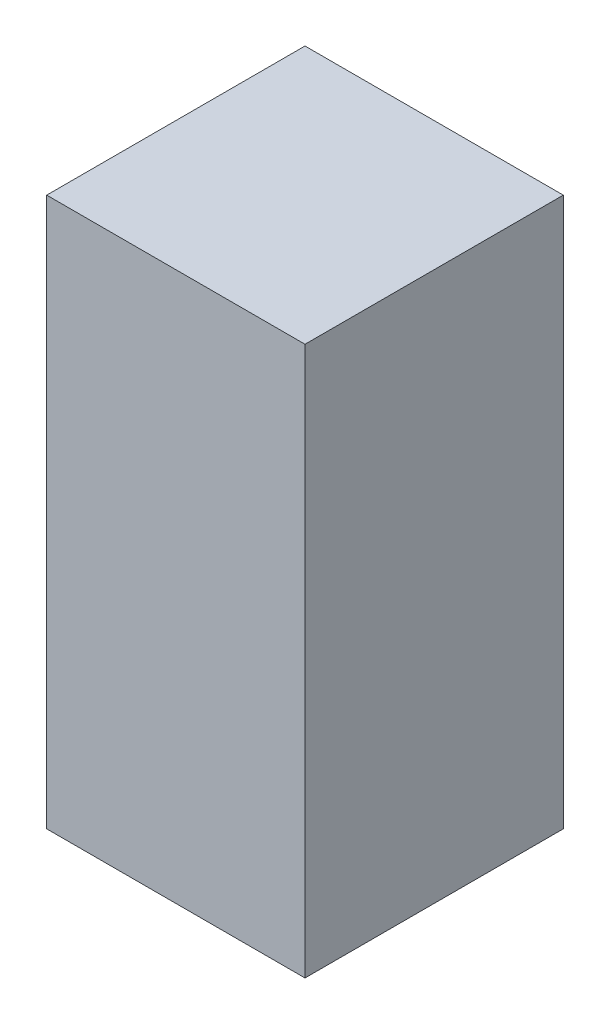
ISO-10303-21;
HEADER;
FILE_DESCRIPTION(('STEP AP214'),'2;1');
FILE_NAME('part.step','',(''),(''),'','','');
FILE_SCHEMA(('AUTOMOTIVE_DESIGN { 1 0 10303 214 1 1 1 1 }'));
ENDSEC;
DATA;
#1=APPLICATION_CONTEXT('core data for automotive mechanical design processes');
#2=APPLICATION_PROTOCOL_DEFINITION('international standard','automotive_design',2000,#1);
#3=PRODUCT_CONTEXT('',#1,'mechanical');
#4=PRODUCT('Part','Part','',(#3));
#5=PRODUCT_RELATED_PRODUCT_CATEGORY('part','',(#4));
#6=PRODUCT_DEFINITION_FORMATION('','',#4);
#7=PRODUCT_DEFINITION_CONTEXT('part definition',#1,'design');
#8=PRODUCT_DEFINITION('design','',#6,#7);
#9=PRODUCT_DEFINITION_SHAPE('','',#8);
#10=(LENGTH_UNIT() NAMED_UNIT(*) SI_UNIT(.MILLI.,.METRE.));
#11=(NAMED_UNIT(*) PLANE_ANGLE_UNIT() SI_UNIT($,.RADIAN.));
#12=(NAMED_UNIT(*) SI_UNIT($,.STERADIAN.) SOLID_ANGLE_UNIT());
#13=UNCERTAINTY_MEASURE_WITH_UNIT(LENGTH_MEASURE(1.E-05),#10,'distance_accuracy_value','');
#14=(GEOMETRIC_REPRESENTATION_CONTEXT(3) GLOBAL_UNCERTAINTY_ASSIGNED_CONTEXT((#13)) GLOBAL_UNIT_ASSIGNED_CONTEXT((#10,
#11,#12)) REPRESENTATION_CONTEXT('',''));
#15=CARTESIAN_POINT('',(0.,0.,0.));
#16=DIRECTION('',(0.,0.,1.));
#17=DIRECTION('',(1.,0.,0.));
#18=AXIS2_PLACEMENT_3D('',#15,#16,#17);
#19=CARTESIAN_POINT('',(0.3999992,-0.85000084,0.));
#20=DIRECTION('',(-1.,0.,0.));
#21=DIRECTION('',(0.,0.,1.));
#22=AXIS2_PLACEMENT_3D('',#19,#20,#21);
#23=PLANE('',#22);
#24=DIRECTION('',(0.,0.,-1.));
#25=VECTOR('',#24,1.);
#26=CARTESIAN_POINT('',(0.3999992,0.85000084,0.));
#27=LINE('',#26,#25);
#28=CARTESIAN_POINT('',(0.3999992,0.85000084,0.));
#29=VERTEX_POINT('',#28);
#30=CARTESIAN_POINT('',(0.3999992,0.85000084,0.80000094));
#31=VERTEX_POINT('',#30);
#32=EDGE_CURVE('E19',#29,#31,#27,.F.);
#33=ORIENTED_EDGE('',*,*,#32,.T.);
#34=DIRECTION('',(0.,1.,0.));
#35=VECTOR('',#34,1.);
#36=CARTESIAN_POINT('',(0.3999992,0.85000084,0.80000094));
#37=LINE('',#36,#35);
#38=CARTESIAN_POINT('',(0.3999992,-0.85000084,0.80000094));
#39=VERTEX_POINT('',#38);
#40=EDGE_CURVE('E54',#31,#39,#37,.F.);
#41=ORIENTED_EDGE('',*,*,#40,.T.);
#42=DIRECTION('',(0.,0.,1.));
#43=VECTOR('',#42,1.);
#44=CARTESIAN_POINT('',(0.3999992,-0.85000084,0.));
#45=LINE('',#44,#43);
#46=CARTESIAN_POINT('',(0.3999992,-0.85000084,0.));
#47=VERTEX_POINT('',#46);
#48=EDGE_CURVE('E73',#39,#47,#45,.F.);
#49=ORIENTED_EDGE('',*,*,#48,.T.);
#50=DIRECTION('',(0.,1.,0.));
#51=VECTOR('',#50,1.);
#52=CARTESIAN_POINT('',(0.3999992,0.85000084,0.));
#53=LINE('',#52,#51);
#54=EDGE_CURVE('E65',#29,#47,#53,.F.);
#55=ORIENTED_EDGE('',*,*,#54,.F.);
#56=EDGE_LOOP('',(#33,#41,#49,#55));
#57=FACE_BOUND('',#56,.T.);
#58=ADVANCED_FACE('F16',(#57),#23,.F.);
#59=CARTESIAN_POINT('',(0.3999992,0.85000084,0.));
#60=DIRECTION('',(0.,-1.,0.));
#61=DIRECTION('',(0.,0.,-1.));
#62=AXIS2_PLACEMENT_3D('',#59,#60,#61);
#63=PLANE('',#62);
#64=DIRECTION('',(0.,0.,-1.));
#65=VECTOR('',#64,1.);
#66=CARTESIAN_POINT('',(-0.3999992,0.85000084,0.));
#67=LINE('',#66,#65);
#68=CARTESIAN_POINT('',(-0.3999992,0.85000084,0.));
#69=VERTEX_POINT('',#68);
#70=CARTESIAN_POINT('',(-0.3999992,0.85000084,0.80000094));
#71=VERTEX_POINT('',#70);
#72=EDGE_CURVE('E71',#69,#71,#67,.F.);
#73=ORIENTED_EDGE('',*,*,#72,.T.);
#74=DIRECTION('',(-1.,0.,0.));
#75=VECTOR('',#74,1.);
#76=CARTESIAN_POINT('',(0.3999992,0.85000084,0.80000094));
#77=LINE('',#76,#75);
#78=EDGE_CURVE('E61',#71,#31,#77,.F.);
#79=ORIENTED_EDGE('',*,*,#78,.T.);
#80=ORIENTED_EDGE('',*,*,#32,.F.);
#81=DIRECTION('',(-1.,0.,0.));
#82=VECTOR('',#81,1.);
#83=CARTESIAN_POINT('',(0.3999992,0.85000084,0.));
#84=LINE('',#83,#82);
#85=EDGE_CURVE('E79',#69,#29,#84,.F.);
#86=ORIENTED_EDGE('',*,*,#85,.F.);
#87=EDGE_LOOP('',(#73,#79,#80,#86));
#88=FACE_BOUND('',#87,.T.);
#89=ADVANCED_FACE('F70',(#88),#63,.F.);
#90=CARTESIAN_POINT('',(0.3999992,0.85000084,0.80000094));
#91=DIRECTION('',(0.,0.,-1.));
#92=DIRECTION('',(-1.,0.,0.));
#93=AXIS2_PLACEMENT_3D('',#90,#91,#92);
#94=PLANE('',#93);
#95=DIRECTION('',(0.,1.,0.));
#96=VECTOR('',#95,1.);
#97=CARTESIAN_POINT('',(-0.3999992,0.85000084,0.80000094));
#98=LINE('',#97,#96);
#99=CARTESIAN_POINT('',(-0.3999992,-0.85000084,0.80000094));
#100=VERTEX_POINT('',#99);
#101=EDGE_CURVE('E82',#71,#100,#98,.F.);
#102=ORIENTED_EDGE('',*,*,#101,.T.);
#103=DIRECTION('',(1.,0.,0.));
#104=VECTOR('',#103,1.);
#105=CARTESIAN_POINT('',(-0.3999992,-0.85000084,0.80000094));
#106=LINE('',#105,#104);
#107=EDGE_CURVE('E63',#100,#39,#106,.T.);
#108=ORIENTED_EDGE('',*,*,#107,.T.);
#109=ORIENTED_EDGE('',*,*,#40,.F.);
#110=ORIENTED_EDGE('',*,*,#78,.F.);
#111=EDGE_LOOP('',(#102,#108,#109,#110));
#112=FACE_BOUND('',#111,.T.);
#113=ADVANCED_FACE('F59',(#112),#94,.F.);
#114=CARTESIAN_POINT('',(-0.3999992,-0.85000084,0.));
#115=DIRECTION('',(0.,1.,0.));
#116=DIRECTION('',(0.,0.,1.));
#117=AXIS2_PLACEMENT_3D('',#114,#115,#116);
#118=PLANE('',#117);
#119=ORIENTED_EDGE('',*,*,#48,.F.);
#120=ORIENTED_EDGE('',*,*,#107,.F.);
#121=DIRECTION('',(0.,0.,-1.));
#122=VECTOR('',#121,1.);
#123=CARTESIAN_POINT('',(-0.3999992,-0.85000084,0.));
#124=LINE('',#123,#122);
#125=CARTESIAN_POINT('',(-0.3999992,-0.85000084,0.));
#126=VERTEX_POINT('',#125);
#127=EDGE_CURVE('E25',#100,#126,#124,.T.);
#128=ORIENTED_EDGE('',*,*,#127,.T.);
#129=DIRECTION('',(-1.,0.,0.));
#130=VECTOR('',#129,1.);
#131=CARTESIAN_POINT('',(0.3999992,-0.85000084,0.));
#132=LINE('',#131,#130);
#133=EDGE_CURVE('E33',#47,#126,#132,.T.);
#134=ORIENTED_EDGE('',*,*,#133,.F.);
#135=EDGE_LOOP('',(#119,#120,#128,#134));
#136=FACE_BOUND('',#135,.T.);
#137=ADVANCED_FACE('F87',(#136),#118,.F.);
#138=CARTESIAN_POINT('',(0.3999992,0.85000084,0.));
#139=DIRECTION('',(0.,0.,-1.));
#140=DIRECTION('',(-1.,0.,0.));
#141=AXIS2_PLACEMENT_3D('',#138,#139,#140);
#142=PLANE('',#141);
#143=DIRECTION('',(0.,1.,0.));
#144=VECTOR('',#143,1.);
#145=CARTESIAN_POINT('',(-0.3999992,0.85000084,0.));
#146=LINE('',#145,#144);
#147=EDGE_CURVE('E11',#126,#69,#146,.T.);
#148=ORIENTED_EDGE('',*,*,#147,.T.);
#149=ORIENTED_EDGE('',*,*,#85,.T.);
#150=ORIENTED_EDGE('',*,*,#54,.T.);
#151=ORIENTED_EDGE('',*,*,#133,.T.);
#152=EDGE_LOOP('',(#148,#149,#150,#151));
#153=FACE_BOUND('',#152,.T.);
#154=ADVANCED_FACE('F90',(#153),#142,.T.);
#155=CARTESIAN_POINT('',(-0.3999992,0.85000084,0.));
#156=DIRECTION('',(1.,0.,0.));
#157=DIRECTION('',(0.,0.,-1.));
#158=AXIS2_PLACEMENT_3D('',#155,#156,#157);
#159=PLANE('',#158);
#160=ORIENTED_EDGE('',*,*,#127,.F.);
#161=ORIENTED_EDGE('',*,*,#101,.F.);
#162=ORIENTED_EDGE('',*,*,#72,.F.);
#163=ORIENTED_EDGE('',*,*,#147,.F.);
#164=EDGE_LOOP('',(#160,#161,#162,#163));
#165=FACE_BOUND('',#164,.T.);
#166=ADVANCED_FACE('F89',(#165),#159,.F.);
#167=CLOSED_SHELL('',(#58,#89,#113,#137,#154,#166));
#168=MANIFOLD_SOLID_BREP('B1',#167);
#169=ADVANCED_BREP_SHAPE_REPRESENTATION('',(#18,#168),#14);
#170=SHAPE_DEFINITION_REPRESENTATION(#9,#169);
ENDSEC;
END-ISO-10303-21;
